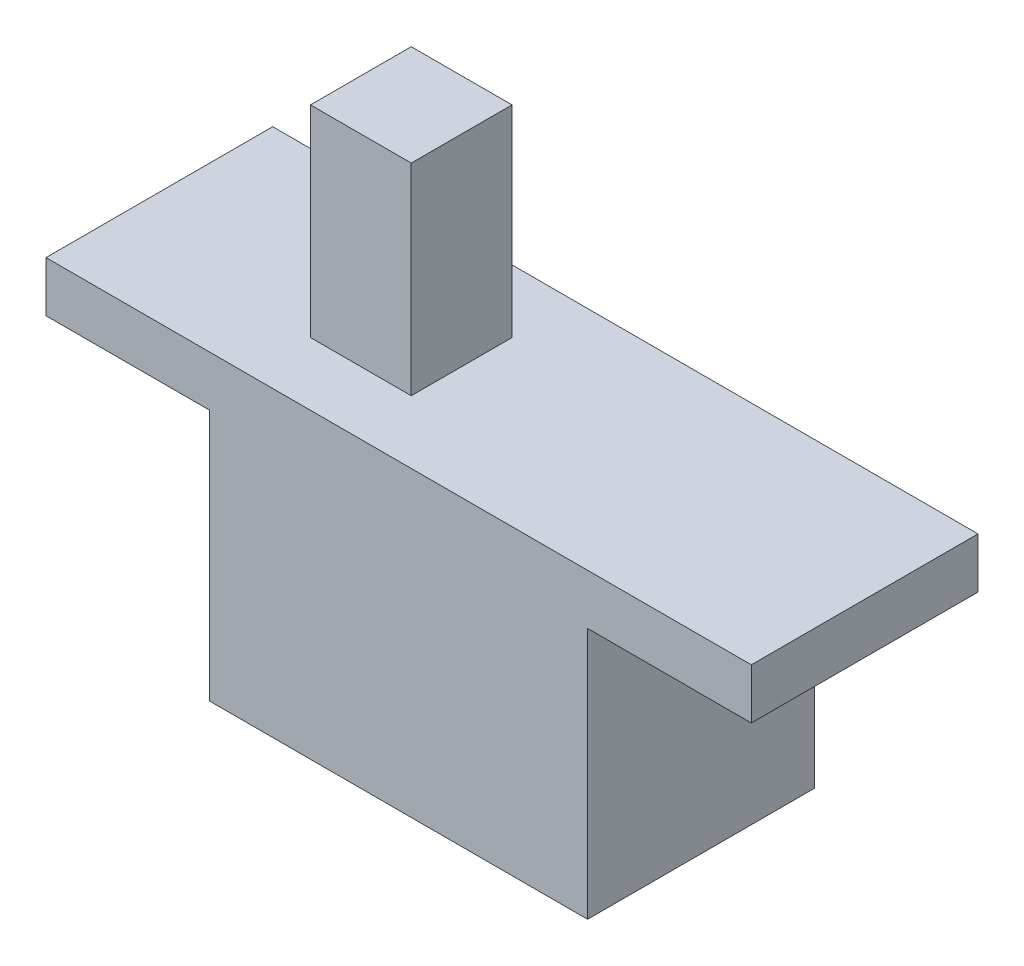
ISO-10303-21;
HEADER;
FILE_DESCRIPTION(('STEP AP214'),'2;1');
FILE_NAME('part.step','',(''),(''),'','','');
FILE_SCHEMA(('AUTOMOTIVE_DESIGN { 1 0 10303 214 1 1 1 1 }'));
ENDSEC;
DATA;
#1=APPLICATION_CONTEXT('core data for automotive mechanical design processes');
#2=APPLICATION_PROTOCOL_DEFINITION('international standard','automotive_design',2000,#1);
#3=PRODUCT_CONTEXT('',#1,'mechanical');
#4=PRODUCT('Part','Part','',(#3));
#5=PRODUCT_RELATED_PRODUCT_CATEGORY('part','',(#4));
#6=PRODUCT_DEFINITION_FORMATION('','',#4);
#7=PRODUCT_DEFINITION_CONTEXT('part definition',#1,'design');
#8=PRODUCT_DEFINITION('design','',#6,#7);
#9=PRODUCT_DEFINITION_SHAPE('','',#8);
#10=(LENGTH_UNIT() NAMED_UNIT(*) SI_UNIT(.MILLI.,.METRE.));
#11=(NAMED_UNIT(*) PLANE_ANGLE_UNIT() SI_UNIT($,.RADIAN.));
#12=(NAMED_UNIT(*) SI_UNIT($,.STERADIAN.) SOLID_ANGLE_UNIT());
#13=UNCERTAINTY_MEASURE_WITH_UNIT(LENGTH_MEASURE(1.E-05),#10,'distance_accuracy_value','');
#14=(GEOMETRIC_REPRESENTATION_CONTEXT(3) GLOBAL_UNCERTAINTY_ASSIGNED_CONTEXT((#13)) GLOBAL_UNIT_ASSIGNED_CONTEXT((#10,
#11,#12)) REPRESENTATION_CONTEXT('',''));
#15=CARTESIAN_POINT('',(0.,0.,0.));
#16=DIRECTION('',(0.,0.,1.));
#17=DIRECTION('',(1.,0.,0.));
#18=AXIS2_PLACEMENT_3D('',#15,#16,#17);
#19=CARTESIAN_POINT('',(0.,1.,0.));
#20=DIRECTION('',(0.,-1.,0.));
#21=DIRECTION('',(0.,0.,-1.));
#22=AXIS2_PLACEMENT_3D('',#19,#20,#21);
#23=PLANE('',#22);
#24=DIRECTION('',(-1.,0.,0.));
#25=VECTOR('',#24,1.);
#26=CARTESIAN_POINT('',(0.,1.,-4.5));
#27=LINE('',#26,#25);
#28=CARTESIAN_POINT('',(14.,1.,-4.5));
#29=VERTEX_POINT('',#28);
#30=CARTESIAN_POINT('',(0.,1.,-4.5));
#31=VERTEX_POINT('',#30);
#32=EDGE_CURVE('E199',#29,#31,#27,.T.);
#33=ORIENTED_EDGE('',*,*,#32,.T.);
#34=DIRECTION('',(0.,0.,1.));
#35=VECTOR('',#34,1.);
#36=CARTESIAN_POINT('',(0.,1.,0.));
#37=LINE('',#36,#35);
#38=CARTESIAN_POINT('',(0.,1.,0.));
#39=VERTEX_POINT('',#38);
#40=EDGE_CURVE('E188',#31,#39,#37,.T.);
#41=ORIENTED_EDGE('',*,*,#40,.T.);
#42=DIRECTION('',(1.,0.,0.));
#43=VECTOR('',#42,1.);
#44=CARTESIAN_POINT('',(0.,1.,0.));
#45=LINE('',#44,#43);
#46=CARTESIAN_POINT('',(14.,1.,0.));
#47=VERTEX_POINT('',#46);
#48=EDGE_CURVE('E192',#39,#47,#45,.T.);
#49=ORIENTED_EDGE('',*,*,#48,.T.);
#50=DIRECTION('',(0.,0.,-1.));
#51=VECTOR('',#50,1.);
#52=CARTESIAN_POINT('',(14.,1.,0.));
#53=LINE('',#52,#51);
#54=EDGE_CURVE('E196',#47,#29,#53,.T.);
#55=ORIENTED_EDGE('',*,*,#54,.T.);
#56=EDGE_LOOP('',(#33,#41,#49,#55));
#57=FACE_BOUND('',#56,.T.);
#58=DIRECTION('',(0.,0.,1.));
#59=VECTOR('',#58,1.);
#60=CARTESIAN_POINT('',(4.,1.,-3.25));
#61=LINE('',#60,#59);
#62=CARTESIAN_POINT('',(4.,1.,-3.25));
#63=VERTEX_POINT('',#62);
#64=CARTESIAN_POINT('',(4.,1.,-1.25));
#65=VERTEX_POINT('',#64);
#66=EDGE_CURVE('E150',#63,#65,#61,.T.);
#67=ORIENTED_EDGE('',*,*,#66,.F.);
#68=DIRECTION('',(-1.,0.,0.));
#69=VECTOR('',#68,1.);
#70=CARTESIAN_POINT('',(4.,1.,-3.25));
#71=LINE('',#70,#69);
#72=CARTESIAN_POINT('',(6.,1.,-3.25));
#73=VERTEX_POINT('',#72);
#74=EDGE_CURVE('E147',#73,#63,#71,.T.);
#75=ORIENTED_EDGE('',*,*,#74,.F.);
#76=DIRECTION('',(0.,0.,-1.));
#77=VECTOR('',#76,1.);
#78=CARTESIAN_POINT('',(6.,1.,-3.25));
#79=LINE('',#78,#77);
#80=CARTESIAN_POINT('',(6.,1.,-1.25));
#81=VERTEX_POINT('',#80);
#82=EDGE_CURVE('E60',#81,#73,#79,.T.);
#83=ORIENTED_EDGE('',*,*,#82,.F.);
#84=DIRECTION('',(1.,0.,0.));
#85=VECTOR('',#84,1.);
#86=CARTESIAN_POINT('',(4.,1.,-1.25));
#87=LINE('',#86,#85);
#88=EDGE_CURVE('E55',#65,#81,#87,.T.);
#89=ORIENTED_EDGE('',*,*,#88,.F.);
#90=EDGE_LOOP('',(#67,#75,#83,#89));
#91=FACE_BOUND('',#90,.T.);
#92=ADVANCED_FACE('F39',(#57,#91),#23,.F.);
#93=CARTESIAN_POINT('',(0.,0.,0.));
#94=DIRECTION('',(0.,-1.,0.));
#95=DIRECTION('',(0.,0.,-1.));
#96=AXIS2_PLACEMENT_3D('',#93,#94,#95);
#97=PLANE('',#96);
#98=DIRECTION('',(0.,0.,-1.));
#99=VECTOR('',#98,1.);
#100=CARTESIAN_POINT('',(3.25,0.,0.));
#101=LINE('',#100,#99);
#102=CARTESIAN_POINT('',(3.25,0.,0.));
#103=VERTEX_POINT('',#102);
#104=CARTESIAN_POINT('',(3.25,0.,-4.5));
#105=VERTEX_POINT('',#104);
#106=EDGE_CURVE('E11',#103,#105,#101,.T.);
#107=ORIENTED_EDGE('',*,*,#106,.F.);
#108=DIRECTION('',(1.,0.,0.));
#109=VECTOR('',#108,1.);
#110=CARTESIAN_POINT('',(0.,0.,0.));
#111=LINE('',#110,#109);
#112=CARTESIAN_POINT('',(0.,0.,0.));
#113=VERTEX_POINT('',#112);
#114=EDGE_CURVE('E207',#113,#103,#111,.T.);
#115=ORIENTED_EDGE('',*,*,#114,.F.);
#116=DIRECTION('',(0.,0.,1.));
#117=VECTOR('',#116,1.);
#118=CARTESIAN_POINT('',(0.,0.,0.));
#119=LINE('',#118,#117);
#120=CARTESIAN_POINT('',(0.,0.,-4.5));
#121=VERTEX_POINT('',#120);
#122=EDGE_CURVE('E179',#121,#113,#119,.T.);
#123=ORIENTED_EDGE('',*,*,#122,.F.);
#124=DIRECTION('',(-1.,0.,0.));
#125=VECTOR('',#124,1.);
#126=CARTESIAN_POINT('',(0.,0.,-4.5));
#127=LINE('',#126,#125);
#128=EDGE_CURVE('E214',#105,#121,#127,.T.);
#129=ORIENTED_EDGE('',*,*,#128,.F.);
#130=EDGE_LOOP('',(#107,#115,#123,#129));
#131=FACE_BOUND('',#130,.T.);
#132=ADVANCED_FACE('F258',(#131),#97,.T.);
#133=CARTESIAN_POINT('',(0.,1.,0.));
#134=DIRECTION('',(1.,0.,0.));
#135=DIRECTION('',(0.,0.,-1.));
#136=AXIS2_PLACEMENT_3D('',#133,#134,#135);
#137=PLANE('',#136);
#138=ORIENTED_EDGE('',*,*,#122,.T.);
#139=DIRECTION('',(0.,-1.,0.));
#140=VECTOR('',#139,1.);
#141=CARTESIAN_POINT('',(0.,1.,0.));
#142=LINE('',#141,#140);
#143=EDGE_CURVE('E229',#39,#113,#142,.T.);
#144=ORIENTED_EDGE('',*,*,#143,.F.);
#145=ORIENTED_EDGE('',*,*,#40,.F.);
#146=DIRECTION('',(0.,-1.,0.));
#147=VECTOR('',#146,1.);
#148=CARTESIAN_POINT('',(0.,1.,-4.5));
#149=LINE('',#148,#147);
#150=EDGE_CURVE('E202',#31,#121,#149,.T.);
#151=ORIENTED_EDGE('',*,*,#150,.T.);
#152=EDGE_LOOP('',(#138,#144,#145,#151));
#153=FACE_BOUND('',#152,.T.);
#154=ADVANCED_FACE('F41',(#153),#137,.F.);
#155=CARTESIAN_POINT('',(0.,1.,0.));
#156=DIRECTION('',(0.,0.,-1.));
#157=DIRECTION('',(-1.,0.,0.));
#158=AXIS2_PLACEMENT_3D('',#155,#156,#157);
#159=PLANE('',#158);
#160=DIRECTION('',(0.,-1.,0.));
#161=VECTOR('',#160,1.);
#162=CARTESIAN_POINT('',(14.,1.,0.));
#163=LINE('',#162,#161);
#164=CARTESIAN_POINT('',(14.,0.,0.));
#165=VERTEX_POINT('',#164);
#166=EDGE_CURVE('E225',#47,#165,#163,.T.);
#167=ORIENTED_EDGE('',*,*,#166,.F.);
#168=ORIENTED_EDGE('',*,*,#48,.F.);
#169=ORIENTED_EDGE('',*,*,#143,.T.);
#170=ORIENTED_EDGE('',*,*,#114,.T.);
#171=DIRECTION('',(0.,1.,0.));
#172=VECTOR('',#171,1.);
#173=CARTESIAN_POINT('',(3.25,-5.,0.));
#174=LINE('',#173,#172);
#175=CARTESIAN_POINT('',(3.25,-5.,0.));
#176=VERTEX_POINT('',#175);
#177=EDGE_CURVE('E174',#176,#103,#174,.T.);
#178=ORIENTED_EDGE('',*,*,#177,.F.);
#179=DIRECTION('',(1.,0.,0.));
#180=VECTOR('',#179,1.);
#181=CARTESIAN_POINT('',(3.25,-5.,0.));
#182=LINE('',#181,#180);
#183=CARTESIAN_POINT('',(10.75,-5.,0.));
#184=VERTEX_POINT('',#183);
#185=EDGE_CURVE('E157',#176,#184,#182,.T.);
#186=ORIENTED_EDGE('',*,*,#185,.T.);
#187=DIRECTION('',(0.,1.,0.));
#188=VECTOR('',#187,1.);
#189=CARTESIAN_POINT('',(10.75,-5.,0.));
#190=LINE('',#189,#188);
#191=CARTESIAN_POINT('',(10.75,0.,0.));
#192=VERTEX_POINT('',#191);
#193=EDGE_CURVE('E183',#184,#192,#190,.T.);
#194=ORIENTED_EDGE('',*,*,#193,.T.);
#195=EDGE_CURVE('E206',#192,#165,#111,.T.);
#196=ORIENTED_EDGE('',*,*,#195,.T.);
#197=EDGE_LOOP('',(#167,#168,#169,#170,#178,#186,#194,#196));
#198=FACE_BOUND('',#197,.T.);
#199=ADVANCED_FACE('F259',(#198),#159,.F.);
#200=CARTESIAN_POINT('',(14.,1.,0.));
#201=DIRECTION('',(-1.,0.,0.));
#202=DIRECTION('',(0.,0.,1.));
#203=AXIS2_PLACEMENT_3D('',#200,#201,#202);
#204=PLANE('',#203);
#205=DIRECTION('',(0.,0.,-1.));
#206=VECTOR('',#205,1.);
#207=CARTESIAN_POINT('',(14.,0.,0.));
#208=LINE('',#207,#206);
#209=CARTESIAN_POINT('',(14.,0.,-4.5));
#210=VERTEX_POINT('',#209);
#211=EDGE_CURVE('E211',#165,#210,#208,.T.);
#212=ORIENTED_EDGE('',*,*,#211,.T.);
#213=DIRECTION('',(0.,-1.,0.));
#214=VECTOR('',#213,1.);
#215=CARTESIAN_POINT('',(14.,1.,-4.5));
#216=LINE('',#215,#214);
#217=EDGE_CURVE('E221',#29,#210,#216,.T.);
#218=ORIENTED_EDGE('',*,*,#217,.F.);
#219=ORIENTED_EDGE('',*,*,#54,.F.);
#220=ORIENTED_EDGE('',*,*,#166,.T.);
#221=EDGE_LOOP('',(#212,#218,#219,#220));
#222=FACE_BOUND('',#221,.T.);
#223=ADVANCED_FACE('F264',(#222),#204,.F.);
#224=CARTESIAN_POINT('',(0.,1.,-4.5));
#225=DIRECTION('',(0.,0.,1.));
#226=DIRECTION('',(1.,0.,0.));
#227=AXIS2_PLACEMENT_3D('',#224,#225,#226);
#228=PLANE('',#227);
#229=CARTESIAN_POINT('',(10.75,0.,-4.5));
#230=VERTEX_POINT('',#229);
#231=EDGE_CURVE('E193',#210,#230,#127,.T.);
#232=ORIENTED_EDGE('',*,*,#231,.T.);
#233=DIRECTION('',(0.,1.,0.));
#234=VECTOR('',#233,1.);
#235=CARTESIAN_POINT('',(10.75,-5.,-4.5));
#236=LINE('',#235,#234);
#237=CARTESIAN_POINT('',(10.75,-5.,-4.5));
#238=VERTEX_POINT('',#237);
#239=EDGE_CURVE('E180',#238,#230,#236,.T.);
#240=ORIENTED_EDGE('',*,*,#239,.F.);
#241=DIRECTION('',(-1.,0.,0.));
#242=VECTOR('',#241,1.);
#243=CARTESIAN_POINT('',(3.25,-5.,-4.5));
#244=LINE('',#243,#242);
#245=CARTESIAN_POINT('',(3.25,-5.,-4.5));
#246=VERTEX_POINT('',#245);
#247=EDGE_CURVE('E170',#238,#246,#244,.T.);
#248=ORIENTED_EDGE('',*,*,#247,.T.);
#249=DIRECTION('',(0.,1.,0.));
#250=VECTOR('',#249,1.);
#251=CARTESIAN_POINT('',(3.25,-5.,-4.5));
#252=LINE('',#251,#250);
#253=EDGE_CURVE('E175',#246,#105,#252,.T.);
#254=ORIENTED_EDGE('',*,*,#253,.T.);
#255=ORIENTED_EDGE('',*,*,#128,.T.);
#256=ORIENTED_EDGE('',*,*,#150,.F.);
#257=ORIENTED_EDGE('',*,*,#32,.F.);
#258=ORIENTED_EDGE('',*,*,#217,.T.);
#259=EDGE_LOOP('',(#232,#240,#248,#254,#255,#256,#257,#258));
#260=FACE_BOUND('',#259,.T.);
#261=ADVANCED_FACE('F250',(#260),#228,.F.);
#262=DIRECTION('',(0.,0.,1.));
#263=VECTOR('',#262,1.);
#264=CARTESIAN_POINT('',(10.75,0.,0.));
#265=LINE('',#264,#263);
#266=EDGE_CURVE('E48',#230,#192,#265,.T.);
#267=ORIENTED_EDGE('',*,*,#266,.F.);
#268=ORIENTED_EDGE('',*,*,#231,.F.);
#269=ORIENTED_EDGE('',*,*,#211,.F.);
#270=ORIENTED_EDGE('',*,*,#195,.F.);
#271=EDGE_LOOP('',(#267,#268,#269,#270));
#272=FACE_BOUND('',#271,.T.);
#273=ADVANCED_FACE('F242',(#272),#97,.T.);
#274=CARTESIAN_POINT('',(3.25,-5.,0.));
#275=DIRECTION('',(-1.,0.,0.));
#276=DIRECTION('',(0.,0.,1.));
#277=AXIS2_PLACEMENT_3D('',#274,#275,#276);
#278=PLANE('',#277);
#279=ORIENTED_EDGE('',*,*,#177,.T.);
#280=ORIENTED_EDGE('',*,*,#106,.T.);
#281=ORIENTED_EDGE('',*,*,#253,.F.);
#282=DIRECTION('',(0.,0.,1.));
#283=VECTOR('',#282,1.);
#284=CARTESIAN_POINT('',(3.25,-5.,0.));
#285=LINE('',#284,#283);
#286=EDGE_CURVE('E152',#246,#176,#285,.T.);
#287=ORIENTED_EDGE('',*,*,#286,.T.);
#288=EDGE_LOOP('',(#279,#280,#281,#287));
#289=FACE_BOUND('',#288,.T.);
#290=ADVANCED_FACE('F279',(#289),#278,.T.);
#291=CARTESIAN_POINT('',(10.75,-5.,0.));
#292=DIRECTION('',(1.,0.,0.));
#293=DIRECTION('',(0.,0.,-1.));
#294=AXIS2_PLACEMENT_3D('',#291,#292,#293);
#295=PLANE('',#294);
#296=ORIENTED_EDGE('',*,*,#239,.T.);
#297=ORIENTED_EDGE('',*,*,#266,.T.);
#298=ORIENTED_EDGE('',*,*,#193,.F.);
#299=DIRECTION('',(0.,0.,-1.));
#300=VECTOR('',#299,1.);
#301=CARTESIAN_POINT('',(10.75,-5.,0.));
#302=LINE('',#301,#300);
#303=EDGE_CURVE('E166',#184,#238,#302,.T.);
#304=ORIENTED_EDGE('',*,*,#303,.T.);
#305=EDGE_LOOP('',(#296,#297,#298,#304));
#306=FACE_BOUND('',#305,.T.);
#307=ADVANCED_FACE('F237',(#306),#295,.T.);
#308=CARTESIAN_POINT('',(0.,-5.,0.));
#309=DIRECTION('',(0.,-1.,0.));
#310=DIRECTION('',(0.,0.,-1.));
#311=AXIS2_PLACEMENT_3D('',#308,#309,#310);
#312=PLANE('',#311);
#313=ORIENTED_EDGE('',*,*,#286,.F.);
#314=ORIENTED_EDGE('',*,*,#247,.F.);
#315=ORIENTED_EDGE('',*,*,#303,.F.);
#316=ORIENTED_EDGE('',*,*,#185,.F.);
#317=EDGE_LOOP('',(#313,#314,#315,#316));
#318=FACE_BOUND('',#317,.T.);
#319=ADVANCED_FACE('F289',(#318),#312,.T.);
#320=CARTESIAN_POINT('',(4.,5.,-3.25));
#321=DIRECTION('',(1.,0.,0.));
#322=DIRECTION('',(0.,0.,-1.));
#323=AXIS2_PLACEMENT_3D('',#320,#321,#322);
#324=PLANE('',#323);
#325=ORIENTED_EDGE('',*,*,#66,.T.);
#326=DIRECTION('',(0.,-1.,0.));
#327=VECTOR('',#326,1.);
#328=CARTESIAN_POINT('',(4.,5.,-1.25));
#329=LINE('',#328,#327);
#330=CARTESIAN_POINT('',(4.,5.,-1.25));
#331=VERTEX_POINT('',#330);
#332=EDGE_CURVE('E129',#331,#65,#329,.T.);
#333=ORIENTED_EDGE('',*,*,#332,.F.);
#334=DIRECTION('',(0.,0.,1.));
#335=VECTOR('',#334,1.);
#336=CARTESIAN_POINT('',(4.,5.,-3.25));
#337=LINE('',#336,#335);
#338=CARTESIAN_POINT('',(4.,5.,-3.25));
#339=VERTEX_POINT('',#338);
#340=EDGE_CURVE('E137',#339,#331,#337,.T.);
#341=ORIENTED_EDGE('',*,*,#340,.F.);
#342=DIRECTION('',(0.,-1.,0.));
#343=VECTOR('',#342,1.);
#344=CARTESIAN_POINT('',(4.,5.,-3.25));
#345=LINE('',#344,#343);
#346=EDGE_CURVE('E401',#339,#63,#345,.T.);
#347=ORIENTED_EDGE('',*,*,#346,.T.);
#348=EDGE_LOOP('',(#325,#333,#341,#347));
#349=FACE_BOUND('',#348,.T.);
#350=ADVANCED_FACE('F149',(#349),#324,.F.);
#351=CARTESIAN_POINT('',(4.,5.,-1.25));
#352=DIRECTION('',(0.,0.,-1.));
#353=DIRECTION('',(-1.,0.,0.));
#354=AXIS2_PLACEMENT_3D('',#351,#352,#353);
#355=PLANE('',#354);
#356=ORIENTED_EDGE('',*,*,#88,.T.);
#357=DIRECTION('',(0.,-1.,0.));
#358=VECTOR('',#357,1.);
#359=CARTESIAN_POINT('',(6.,5.,-1.25));
#360=LINE('',#359,#358);
#361=CARTESIAN_POINT('',(6.,5.,-1.25));
#362=VERTEX_POINT('',#361);
#363=EDGE_CURVE('E132',#362,#81,#360,.T.);
#364=ORIENTED_EDGE('',*,*,#363,.F.);
#365=DIRECTION('',(1.,0.,0.));
#366=VECTOR('',#365,1.);
#367=CARTESIAN_POINT('',(4.,5.,-1.25));
#368=LINE('',#367,#366);
#369=EDGE_CURVE('E125',#331,#362,#368,.T.);
#370=ORIENTED_EDGE('',*,*,#369,.F.);
#371=ORIENTED_EDGE('',*,*,#332,.T.);
#372=EDGE_LOOP('',(#356,#364,#370,#371));
#373=FACE_BOUND('',#372,.T.);
#374=ADVANCED_FACE('F127',(#373),#355,.F.);
#375=CARTESIAN_POINT('',(6.,5.,-3.25));
#376=DIRECTION('',(-1.,0.,0.));
#377=DIRECTION('',(0.,0.,1.));
#378=AXIS2_PLACEMENT_3D('',#375,#376,#377);
#379=PLANE('',#378);
#380=ORIENTED_EDGE('',*,*,#82,.T.);
#381=DIRECTION('',(0.,-1.,0.));
#382=VECTOR('',#381,1.);
#383=CARTESIAN_POINT('',(6.,5.,-3.25));
#384=LINE('',#383,#382);
#385=CARTESIAN_POINT('',(6.,5.,-3.25));
#386=VERTEX_POINT('',#385);
#387=EDGE_CURVE('E159',#386,#73,#384,.T.);
#388=ORIENTED_EDGE('',*,*,#387,.F.);
#389=DIRECTION('',(0.,0.,-1.));
#390=VECTOR('',#389,1.);
#391=CARTESIAN_POINT('',(6.,5.,-3.25));
#392=LINE('',#391,#390);
#393=EDGE_CURVE('E136',#362,#386,#392,.T.);
#394=ORIENTED_EDGE('',*,*,#393,.F.);
#395=ORIENTED_EDGE('',*,*,#363,.T.);
#396=EDGE_LOOP('',(#380,#388,#394,#395));
#397=FACE_BOUND('',#396,.T.);
#398=ADVANCED_FACE('F303',(#397),#379,.F.);
#399=CARTESIAN_POINT('',(4.,5.,-3.25));
#400=DIRECTION('',(0.,0.,1.));
#401=DIRECTION('',(1.,0.,0.));
#402=AXIS2_PLACEMENT_3D('',#399,#400,#401);
#403=PLANE('',#402);
#404=ORIENTED_EDGE('',*,*,#74,.T.);
#405=ORIENTED_EDGE('',*,*,#346,.F.);
#406=DIRECTION('',(-1.,0.,0.));
#407=VECTOR('',#406,1.);
#408=CARTESIAN_POINT('',(4.,5.,-3.25));
#409=LINE('',#408,#407);
#410=EDGE_CURVE('E142',#386,#339,#409,.T.);
#411=ORIENTED_EDGE('',*,*,#410,.F.);
#412=ORIENTED_EDGE('',*,*,#387,.T.);
#413=EDGE_LOOP('',(#404,#405,#411,#412));
#414=FACE_BOUND('',#413,.T.);
#415=ADVANCED_FACE('F306',(#414),#403,.F.);
#416=CARTESIAN_POINT('',(0.,5.,0.));
#417=DIRECTION('',(0.,1.,0.));
#418=DIRECTION('',(0.,0.,1.));
#419=AXIS2_PLACEMENT_3D('',#416,#417,#418);
#420=PLANE('',#419);
#421=ORIENTED_EDGE('',*,*,#340,.T.);
#422=ORIENTED_EDGE('',*,*,#369,.T.);
#423=ORIENTED_EDGE('',*,*,#393,.T.);
#424=ORIENTED_EDGE('',*,*,#410,.T.);
#425=EDGE_LOOP('',(#421,#422,#423,#424));
#426=FACE_BOUND('',#425,.T.);
#427=ADVANCED_FACE('F140',(#426),#420,.T.);
#428=CLOSED_SHELL('',(#92,#132,#154,#199,#223,#261,#273,#290,#307,#319,#350,#374,#398,#415,#427));
#429=MANIFOLD_SOLID_BREP('B2',#428);
#430=ADVANCED_BREP_SHAPE_REPRESENTATION('',(#18,#429),#14);
#431=SHAPE_DEFINITION_REPRESENTATION(#9,#430);
ENDSEC;
END-ISO-10303-21;
